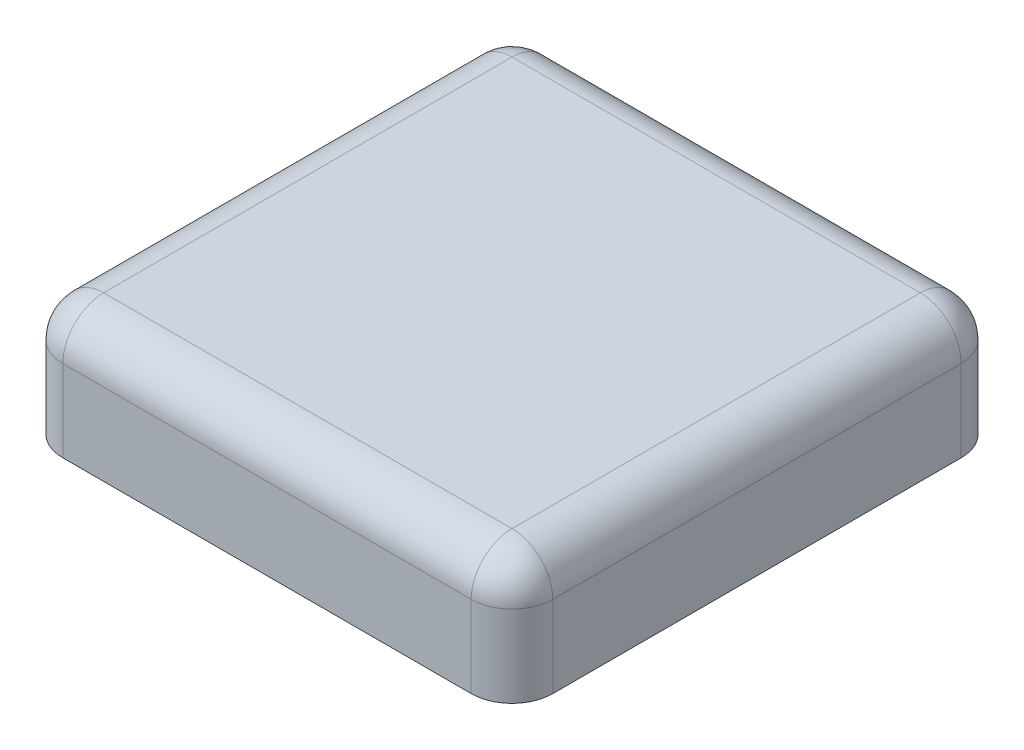
ISO-10303-21;
HEADER;
FILE_DESCRIPTION(('STEP AP214'),'2;1');
FILE_NAME('part.step','',(''),(''),'','','');
FILE_SCHEMA(('AUTOMOTIVE_DESIGN { 1 0 10303 214 1 1 1 1 }'));
ENDSEC;
DATA;
#1=APPLICATION_CONTEXT('core data for automotive mechanical design processes');
#2=APPLICATION_PROTOCOL_DEFINITION('international standard','automotive_design',2000,#1);
#3=PRODUCT_CONTEXT('',#1,'mechanical');
#4=PRODUCT('Part','Part','',(#3));
#5=PRODUCT_RELATED_PRODUCT_CATEGORY('part','',(#4));
#6=PRODUCT_DEFINITION_FORMATION('','',#4);
#7=PRODUCT_DEFINITION_CONTEXT('part definition',#1,'design');
#8=PRODUCT_DEFINITION('design','',#6,#7);
#9=PRODUCT_DEFINITION_SHAPE('','',#8);
#10=(LENGTH_UNIT() NAMED_UNIT(*) SI_UNIT(.MILLI.,.METRE.));
#11=(NAMED_UNIT(*) PLANE_ANGLE_UNIT() SI_UNIT($,.RADIAN.));
#12=(NAMED_UNIT(*) SI_UNIT($,.STERADIAN.) SOLID_ANGLE_UNIT());
#13=UNCERTAINTY_MEASURE_WITH_UNIT(LENGTH_MEASURE(1.E-05),#10,'distance_accuracy_value','');
#14=(GEOMETRIC_REPRESENTATION_CONTEXT(3) GLOBAL_UNCERTAINTY_ASSIGNED_CONTEXT((#13)) GLOBAL_UNIT_ASSIGNED_CONTEXT((#10,
#11,#12)) REPRESENTATION_CONTEXT('',''));
#15=CARTESIAN_POINT('',(0.,0.,0.));
#16=DIRECTION('',(0.,0.,1.));
#17=DIRECTION('',(1.,0.,0.));
#18=AXIS2_PLACEMENT_3D('',#15,#16,#17);
#19=CARTESIAN_POINT('',(0.,38.1,0.));
#20=DIRECTION('',(0.,0.,-1.));
#21=DIRECTION('',(-1.,0.,0.));
#22=AXIS2_PLACEMENT_3D('',#19,#20,#21);
#23=PLANE('',#22);
#24=DIRECTION('',(1.,0.,0.));
#25=VECTOR('',#24,1.);
#26=CARTESIAN_POINT('',(0.,-38.1,0.));
#27=LINE('',#26,#25);
#28=CARTESIAN_POINT('',(25.4,-38.1,0.));
#29=VERTEX_POINT('',#28);
#30=CARTESIAN_POINT('',(279.4,-38.1,0.));
#31=VERTEX_POINT('',#30);
#32=EDGE_CURVE('E130',#29,#31,#27,.T.);
#33=ORIENTED_EDGE('',*,*,#32,.F.);
#34=DIRECTION('',(0.,-1.,0.));
#35=VECTOR('',#34,1.);
#36=CARTESIAN_POINT('',(25.4,38.1,0.));
#37=LINE('',#36,#35);
#38=CARTESIAN_POINT('',(25.4,12.7,0.));
#39=VERTEX_POINT('',#38);
#40=EDGE_CURVE('E63',#29,#39,#37,.F.);
#41=ORIENTED_EDGE('',*,*,#40,.T.);
#42=DIRECTION('',(1.,0.,0.));
#43=VECTOR('',#42,1.);
#44=CARTESIAN_POINT('',(304.8,12.7,0.));
#45=LINE('',#44,#43);
#46=CARTESIAN_POINT('',(279.4,12.7,0.));
#47=VERTEX_POINT('',#46);
#48=EDGE_CURVE('E68',#39,#47,#45,.T.);
#49=ORIENTED_EDGE('',*,*,#48,.T.);
#50=DIRECTION('',(0.,-1.,0.));
#51=VECTOR('',#50,1.);
#52=CARTESIAN_POINT('',(279.4,38.1,0.));
#53=LINE('',#52,#51);
#54=EDGE_CURVE('E188',#47,#31,#53,.T.);
#55=ORIENTED_EDGE('',*,*,#54,.T.);
#56=EDGE_LOOP('',(#33,#41,#49,#55));
#57=FACE_BOUND('',#56,.T.);
#58=ADVANCED_FACE('F45',(#57),#23,.T.);
#59=CARTESIAN_POINT('',(0.,38.1,0.));
#60=DIRECTION('',(1.,0.,0.));
#61=DIRECTION('',(0.,0.,-1.));
#62=AXIS2_PLACEMENT_3D('',#59,#60,#61);
#63=PLANE('',#62);
#64=DIRECTION('',(0.,0.,1.));
#65=VECTOR('',#64,1.);
#66=CARTESIAN_POINT('',(0.,12.7,0.));
#67=LINE('',#66,#65);
#68=CARTESIAN_POINT('',(0.,12.7,279.4));
#69=VERTEX_POINT('',#68);
#70=CARTESIAN_POINT('',(0.,12.7,25.4));
#71=VERTEX_POINT('',#70);
#72=EDGE_CURVE('E182',#69,#71,#67,.F.);
#73=ORIENTED_EDGE('',*,*,#72,.T.);
#74=DIRECTION('',(0.,-1.,0.));
#75=VECTOR('',#74,1.);
#76=CARTESIAN_POINT('',(0.,-38.1,25.4));
#77=LINE('',#76,#75);
#78=CARTESIAN_POINT('',(0.,-38.1,25.4));
#79=VERTEX_POINT('',#78);
#80=EDGE_CURVE('E185',#71,#79,#77,.T.);
#81=ORIENTED_EDGE('',*,*,#80,.T.);
#82=DIRECTION('',(0.,0.,1.));
#83=VECTOR('',#82,1.);
#84=CARTESIAN_POINT('',(0.,-38.1,0.));
#85=LINE('',#84,#83);
#86=CARTESIAN_POINT('',(0.,-38.1,279.4));
#87=VERTEX_POINT('',#86);
#88=EDGE_CURVE('E249',#79,#87,#85,.T.);
#89=ORIENTED_EDGE('',*,*,#88,.T.);
#90=DIRECTION('',(0.,-1.,0.));
#91=VECTOR('',#90,1.);
#92=CARTESIAN_POINT('',(0.,38.1,279.4));
#93=LINE('',#92,#91);
#94=EDGE_CURVE('E179',#87,#69,#93,.F.);
#95=ORIENTED_EDGE('',*,*,#94,.T.);
#96=EDGE_LOOP('',(#73,#81,#89,#95));
#97=FACE_BOUND('',#96,.T.);
#98=ADVANCED_FACE('F255',(#97),#63,.F.);
#99=CARTESIAN_POINT('',(0.,38.1,304.8));
#100=DIRECTION('',(0.,0.,-1.));
#101=DIRECTION('',(-1.,0.,0.));
#102=AXIS2_PLACEMENT_3D('',#99,#100,#101);
#103=PLANE('',#102);
#104=DIRECTION('',(1.,0.,0.));
#105=VECTOR('',#104,1.);
#106=CARTESIAN_POINT('',(0.,-38.1,304.8));
#107=LINE('',#106,#105);
#108=CARTESIAN_POINT('',(25.4,-38.1,304.8));
#109=VERTEX_POINT('',#108);
#110=CARTESIAN_POINT('',(279.4,-38.1,304.8));
#111=VERTEX_POINT('',#110);
#112=EDGE_CURVE('E144',#109,#111,#107,.T.);
#113=ORIENTED_EDGE('',*,*,#112,.T.);
#114=DIRECTION('',(0.,-1.,0.));
#115=VECTOR('',#114,1.);
#116=CARTESIAN_POINT('',(279.4,38.1,304.8));
#117=LINE('',#116,#115);
#118=CARTESIAN_POINT('',(279.4,12.7,304.8));
#119=VERTEX_POINT('',#118);
#120=EDGE_CURVE('E176',#111,#119,#117,.F.);
#121=ORIENTED_EDGE('',*,*,#120,.T.);
#122=DIRECTION('',(1.,0.,0.));
#123=VECTOR('',#122,1.);
#124=CARTESIAN_POINT('',(0.,12.7,304.8));
#125=LINE('',#124,#123);
#126=CARTESIAN_POINT('',(25.4,12.7,304.8));
#127=VERTEX_POINT('',#126);
#128=EDGE_CURVE('E173',#119,#127,#125,.F.);
#129=ORIENTED_EDGE('',*,*,#128,.T.);
#130=DIRECTION('',(0.,-1.,0.));
#131=VECTOR('',#130,1.);
#132=CARTESIAN_POINT('',(25.4,38.1,304.8));
#133=LINE('',#132,#131);
#134=EDGE_CURVE('E170',#127,#109,#133,.T.);
#135=ORIENTED_EDGE('',*,*,#134,.T.);
#136=EDGE_LOOP('',(#113,#121,#129,#135));
#137=FACE_BOUND('',#136,.T.);
#138=ADVANCED_FACE('F293',(#137),#103,.F.);
#139=CARTESIAN_POINT('',(304.8,38.1,0.));
#140=DIRECTION('',(1.,0.,0.));
#141=DIRECTION('',(0.,0.,-1.));
#142=AXIS2_PLACEMENT_3D('',#139,#140,#141);
#143=PLANE('',#142);
#144=DIRECTION('',(0.,0.,1.));
#145=VECTOR('',#144,1.);
#146=CARTESIAN_POINT('',(304.8,-38.1,0.));
#147=LINE('',#146,#145);
#148=CARTESIAN_POINT('',(304.8,-38.1,25.4));
#149=VERTEX_POINT('',#148);
#150=CARTESIAN_POINT('',(304.8,-38.1,279.4));
#151=VERTEX_POINT('',#150);
#152=EDGE_CURVE('E128',#149,#151,#147,.T.);
#153=ORIENTED_EDGE('',*,*,#152,.F.);
#154=DIRECTION('',(0.,-1.,0.));
#155=VECTOR('',#154,1.);
#156=CARTESIAN_POINT('',(304.8,38.1,25.4));
#157=LINE('',#156,#155);
#158=CARTESIAN_POINT('',(304.8,12.7,25.4));
#159=VERTEX_POINT('',#158);
#160=EDGE_CURVE('E139',#149,#159,#157,.F.);
#161=ORIENTED_EDGE('',*,*,#160,.T.);
#162=DIRECTION('',(0.,0.,1.));
#163=VECTOR('',#162,1.);
#164=CARTESIAN_POINT('',(304.8,12.7,304.8));
#165=LINE('',#164,#163);
#166=CARTESIAN_POINT('',(304.8,12.7,279.4));
#167=VERTEX_POINT('',#166);
#168=EDGE_CURVE('E152',#159,#167,#165,.T.);
#169=ORIENTED_EDGE('',*,*,#168,.T.);
#170=DIRECTION('',(0.,-1.,0.));
#171=VECTOR('',#170,1.);
#172=CARTESIAN_POINT('',(304.8,-38.1,279.4));
#173=LINE('',#172,#171);
#174=EDGE_CURVE('E142',#167,#151,#173,.T.);
#175=ORIENTED_EDGE('',*,*,#174,.T.);
#176=EDGE_LOOP('',(#153,#161,#169,#175));
#177=FACE_BOUND('',#176,.T.);
#178=ADVANCED_FACE('F137',(#177),#143,.T.);
#179=CARTESIAN_POINT('',(0.,38.1,0.));
#180=DIRECTION('',(0.,-1.,0.));
#181=DIRECTION('',(0.,0.,-1.));
#182=AXIS2_PLACEMENT_3D('',#179,#180,#181);
#183=PLANE('',#182);
#184=DIRECTION('',(1.,0.,0.));
#185=VECTOR('',#184,1.);
#186=CARTESIAN_POINT('',(0.,38.1,279.4));
#187=LINE('',#186,#185);
#188=CARTESIAN_POINT('',(25.4,38.1,279.4));
#189=VERTEX_POINT('',#188);
#190=CARTESIAN_POINT('',(279.4,38.1,279.4));
#191=VERTEX_POINT('',#190);
#192=EDGE_CURVE('E163',#189,#191,#187,.T.);
#193=ORIENTED_EDGE('',*,*,#192,.T.);
#194=DIRECTION('',(0.,0.,1.));
#195=VECTOR('',#194,1.);
#196=CARTESIAN_POINT('',(279.4,38.1,0.));
#197=LINE('',#196,#195);
#198=CARTESIAN_POINT('',(279.4,38.1,25.4));
#199=VERTEX_POINT('',#198);
#200=EDGE_CURVE('E166',#191,#199,#197,.F.);
#201=ORIENTED_EDGE('',*,*,#200,.T.);
#202=DIRECTION('',(1.,0.,0.));
#203=VECTOR('',#202,1.);
#204=CARTESIAN_POINT('',(0.,38.1,25.4));
#205=LINE('',#204,#203);
#206=CARTESIAN_POINT('',(25.4,38.1,25.4));
#207=VERTEX_POINT('',#206);
#208=EDGE_CURVE('E151',#199,#207,#205,.F.);
#209=ORIENTED_EDGE('',*,*,#208,.T.);
#210=DIRECTION('',(0.,0.,1.));
#211=VECTOR('',#210,1.);
#212=CARTESIAN_POINT('',(25.4,38.1,0.));
#213=LINE('',#212,#211);
#214=EDGE_CURVE('E156',#207,#189,#213,.T.);
#215=ORIENTED_EDGE('',*,*,#214,.T.);
#216=EDGE_LOOP('',(#193,#201,#209,#215));
#217=FACE_BOUND('',#216,.T.);
#218=ADVANCED_FACE('F298',(#217),#183,.F.);
#219=CARTESIAN_POINT('',(0.,-38.1,0.));
#220=DIRECTION('',(0.,-1.,0.));
#221=DIRECTION('',(0.,0.,-1.));
#222=AXIS2_PLACEMENT_3D('',#219,#220,#221);
#223=PLANE('',#222);
#224=ORIENTED_EDGE('',*,*,#88,.F.);
#225=CARTESIAN_POINT('',(25.4,-38.1,25.4));
#226=DIRECTION('',(0.,-1.,0.));
#227=DIRECTION('',(0.,0.,-1.));
#228=AXIS2_PLACEMENT_3D('',#225,#226,#227);
#229=CIRCLE('',#228,25.4);
#230=EDGE_CURVE('E11',#79,#29,#229,.T.);
#231=ORIENTED_EDGE('',*,*,#230,.T.);
#232=ORIENTED_EDGE('',*,*,#32,.T.);
#233=CARTESIAN_POINT('',(279.4,-38.1,25.4));
#234=DIRECTION('',(0.,-1.,0.));
#235=DIRECTION('',(0.,0.,-1.));
#236=AXIS2_PLACEMENT_3D('',#233,#234,#235);
#237=CIRCLE('',#236,25.4);
#238=EDGE_CURVE('E55',#31,#149,#237,.T.);
#239=ORIENTED_EDGE('',*,*,#238,.T.);
#240=ORIENTED_EDGE('',*,*,#152,.T.);
#241=CARTESIAN_POINT('',(279.4,-38.1,279.4));
#242=DIRECTION('',(0.,-1.,0.));
#243=DIRECTION('',(0.,0.,-1.));
#244=AXIS2_PLACEMENT_3D('',#241,#242,#243);
#245=CIRCLE('',#244,25.4);
#246=EDGE_CURVE('E134',#151,#111,#245,.T.);
#247=ORIENTED_EDGE('',*,*,#246,.T.);
#248=ORIENTED_EDGE('',*,*,#112,.F.);
#249=CARTESIAN_POINT('',(25.4,-38.1,279.4));
#250=DIRECTION('',(0.,-1.,0.));
#251=DIRECTION('',(0.,0.,-1.));
#252=AXIS2_PLACEMENT_3D('',#249,#250,#251);
#253=CIRCLE('',#252,25.4);
#254=EDGE_CURVE('E195',#109,#87,#253,.T.);
#255=ORIENTED_EDGE('',*,*,#254,.T.);
#256=EDGE_LOOP('',(#224,#231,#232,#239,#240,#247,#248,#255));
#257=FACE_BOUND('',#256,.T.);
#258=ADVANCED_FACE('F127',(#257),#223,.T.);
#259=CARTESIAN_POINT('',(25.4,38.1,25.4));
#260=DIRECTION('',(0.,1.,0.));
#261=DIRECTION('',(0.,0.,1.));
#262=AXIS2_PLACEMENT_3D('',#259,#260,#261);
#263=CYLINDRICAL_SURFACE('',#262,25.4);
#264=ORIENTED_EDGE('',*,*,#230,.F.);
#265=ORIENTED_EDGE('',*,*,#80,.F.);
#266=CARTESIAN_POINT('',(25.4,12.7,25.4));
#267=DIRECTION('',(0.,1.,0.));
#268=DIRECTION('',(0.,0.,1.));
#269=AXIS2_PLACEMENT_3D('',#266,#267,#268);
#270=CIRCLE('',#269,25.4);
#271=EDGE_CURVE('E235',#39,#71,#270,.T.);
#272=ORIENTED_EDGE('',*,*,#271,.F.);
#273=ORIENTED_EDGE('',*,*,#40,.F.);
#274=EDGE_LOOP('',(#264,#265,#272,#273));
#275=FACE_BOUND('',#274,.T.);
#276=ADVANCED_FACE('F47',(#275),#263,.T.);
#277=CARTESIAN_POINT('',(25.4,38.1,279.4));
#278=DIRECTION('',(0.,-1.,0.));
#279=DIRECTION('',(0.,0.,-1.));
#280=AXIS2_PLACEMENT_3D('',#277,#278,#279);
#281=CYLINDRICAL_SURFACE('',#280,25.4);
#282=ORIENTED_EDGE('',*,*,#254,.F.);
#283=ORIENTED_EDGE('',*,*,#134,.F.);
#284=CARTESIAN_POINT('',(25.4,12.7,279.4));
#285=DIRECTION('',(0.,1.,0.));
#286=DIRECTION('',(0.,0.,1.));
#287=AXIS2_PLACEMENT_3D('',#284,#285,#286);
#288=CIRCLE('',#287,25.4);
#289=EDGE_CURVE('E232',#69,#127,#288,.T.);
#290=ORIENTED_EDGE('',*,*,#289,.F.);
#291=ORIENTED_EDGE('',*,*,#94,.F.);
#292=EDGE_LOOP('',(#282,#283,#290,#291));
#293=FACE_BOUND('',#292,.T.);
#294=ADVANCED_FACE('F262',(#293),#281,.T.);
#295=CARTESIAN_POINT('',(25.4,12.7,0.));
#296=DIRECTION('',(0.,0.,1.));
#297=DIRECTION('',(1.,0.,0.));
#298=AXIS2_PLACEMENT_3D('',#295,#296,#297);
#299=CYLINDRICAL_SURFACE('',#298,25.4);
#300=CARTESIAN_POINT('',(25.4,12.7,25.4));
#301=DIRECTION('',(0.,0.,-1.));
#302=DIRECTION('',(-1.,0.,0.));
#303=AXIS2_PLACEMENT_3D('',#300,#301,#302);
#304=CIRCLE('',#303,25.4);
#305=EDGE_CURVE('E49',#71,#207,#304,.T.);
#306=ORIENTED_EDGE('',*,*,#305,.F.);
#307=ORIENTED_EDGE('',*,*,#72,.F.);
#308=CARTESIAN_POINT('',(25.4,12.7,279.4));
#309=DIRECTION('',(0.,0.,1.));
#310=DIRECTION('',(1.,0.,0.));
#311=AXIS2_PLACEMENT_3D('',#308,#309,#310);
#312=CIRCLE('',#311,25.4);
#313=EDGE_CURVE('E228',#189,#69,#312,.T.);
#314=ORIENTED_EDGE('',*,*,#313,.F.);
#315=ORIENTED_EDGE('',*,*,#214,.F.);
#316=EDGE_LOOP('',(#306,#307,#314,#315));
#317=FACE_BOUND('',#316,.T.);
#318=ADVANCED_FACE('F271',(#317),#299,.T.);
#319=CARTESIAN_POINT('',(25.4,12.7,25.4));
#320=DIRECTION('',(-1.,0.,0.));
#321=DIRECTION('',(0.,0.,1.));
#322=AXIS2_PLACEMENT_3D('',#319,#320,#321);
#323=SPHERICAL_SURFACE('',#322,25.4);
#324=ORIENTED_EDGE('',*,*,#271,.T.);
#325=ORIENTED_EDGE('',*,*,#305,.T.);
#326=CARTESIAN_POINT('',(25.4,12.7,25.4));
#327=DIRECTION('',(-1.,0.,0.));
#328=DIRECTION('',(0.,0.,1.));
#329=AXIS2_PLACEMENT_3D('',#326,#327,#328);
#330=CIRCLE('',#329,25.4);
#331=EDGE_CURVE('E224',#39,#207,#330,.F.);
#332=ORIENTED_EDGE('',*,*,#331,.F.);
#333=EDGE_LOOP('',(#324,#325,#332));
#334=FACE_BOUND('',#333,.T.);
#335=ADVANCED_FACE('F331',(#334),#323,.T.);
#336=CARTESIAN_POINT('',(25.4,12.7,279.4));
#337=DIRECTION('',(-1.,0.,0.));
#338=DIRECTION('',(0.,0.,1.));
#339=AXIS2_PLACEMENT_3D('',#336,#337,#338);
#340=SPHERICAL_SURFACE('',#339,25.4);
#341=ORIENTED_EDGE('',*,*,#313,.T.);
#342=ORIENTED_EDGE('',*,*,#289,.T.);
#343=CARTESIAN_POINT('',(25.4,12.7,279.4));
#344=DIRECTION('',(-1.,0.,0.));
#345=DIRECTION('',(0.,0.,1.));
#346=AXIS2_PLACEMENT_3D('',#343,#344,#345);
#347=CIRCLE('',#346,25.4);
#348=EDGE_CURVE('E220',#189,#127,#347,.F.);
#349=ORIENTED_EDGE('',*,*,#348,.F.);
#350=EDGE_LOOP('',(#341,#342,#349));
#351=FACE_BOUND('',#350,.T.);
#352=ADVANCED_FACE('F267',(#351),#340,.T.);
#353=CARTESIAN_POINT('',(0.,12.7,25.4));
#354=DIRECTION('',(-1.,0.,0.));
#355=DIRECTION('',(0.,0.,1.));
#356=AXIS2_PLACEMENT_3D('',#353,#354,#355);
#357=CYLINDRICAL_SURFACE('',#356,25.4);
#358=ORIENTED_EDGE('',*,*,#331,.T.);
#359=ORIENTED_EDGE('',*,*,#208,.F.);
#360=CARTESIAN_POINT('',(279.4,12.7,25.4));
#361=DIRECTION('',(1.,0.,0.));
#362=DIRECTION('',(0.,0.,-1.));
#363=AXIS2_PLACEMENT_3D('',#360,#361,#362);
#364=CIRCLE('',#363,25.4);
#365=EDGE_CURVE('E216',#47,#199,#364,.T.);
#366=ORIENTED_EDGE('',*,*,#365,.F.);
#367=ORIENTED_EDGE('',*,*,#48,.F.);
#368=EDGE_LOOP('',(#358,#359,#366,#367));
#369=FACE_BOUND('',#368,.T.);
#370=ADVANCED_FACE('F276',(#369),#357,.T.);
#371=CARTESIAN_POINT('',(279.4,38.1,25.4));
#372=DIRECTION('',(0.,-1.,0.));
#373=DIRECTION('',(0.,0.,-1.));
#374=AXIS2_PLACEMENT_3D('',#371,#372,#373);
#375=CYLINDRICAL_SURFACE('',#374,25.4);
#376=ORIENTED_EDGE('',*,*,#238,.F.);
#377=ORIENTED_EDGE('',*,*,#54,.F.);
#378=CARTESIAN_POINT('',(279.4,12.7,25.4));
#379=DIRECTION('',(0.,1.,0.));
#380=DIRECTION('',(0.,0.,1.));
#381=AXIS2_PLACEMENT_3D('',#378,#379,#380);
#382=CIRCLE('',#381,25.4);
#383=EDGE_CURVE('E148',#159,#47,#382,.T.);
#384=ORIENTED_EDGE('',*,*,#383,.F.);
#385=ORIENTED_EDGE('',*,*,#160,.F.);
#386=EDGE_LOOP('',(#376,#377,#384,#385));
#387=FACE_BOUND('',#386,.T.);
#388=ADVANCED_FACE('F146',(#387),#375,.T.);
#389=CARTESIAN_POINT('',(279.4,38.1,279.4));
#390=DIRECTION('',(0.,1.,0.));
#391=DIRECTION('',(0.,0.,1.));
#392=AXIS2_PLACEMENT_3D('',#389,#390,#391);
#393=CYLINDRICAL_SURFACE('',#392,25.4);
#394=ORIENTED_EDGE('',*,*,#246,.F.);
#395=ORIENTED_EDGE('',*,*,#174,.F.);
#396=CARTESIAN_POINT('',(279.4,12.7,279.4));
#397=DIRECTION('',(0.,1.,0.));
#398=DIRECTION('',(0.,0.,1.));
#399=AXIS2_PLACEMENT_3D('',#396,#397,#398);
#400=CIRCLE('',#399,25.4);
#401=EDGE_CURVE('E210',#119,#167,#400,.T.);
#402=ORIENTED_EDGE('',*,*,#401,.F.);
#403=ORIENTED_EDGE('',*,*,#120,.F.);
#404=EDGE_LOOP('',(#394,#395,#402,#403));
#405=FACE_BOUND('',#404,.T.);
#406=ADVANCED_FACE('F290',(#405),#393,.T.);
#407=CARTESIAN_POINT('',(0.,12.7,279.4));
#408=DIRECTION('',(1.,0.,0.));
#409=DIRECTION('',(0.,0.,-1.));
#410=AXIS2_PLACEMENT_3D('',#407,#408,#409);
#411=CYLINDRICAL_SURFACE('',#410,25.4);
#412=ORIENTED_EDGE('',*,*,#348,.T.);
#413=ORIENTED_EDGE('',*,*,#128,.F.);
#414=CARTESIAN_POINT('',(279.4,12.7,279.4));
#415=DIRECTION('',(1.,0.,0.));
#416=DIRECTION('',(0.,0.,-1.));
#417=AXIS2_PLACEMENT_3D('',#414,#415,#416);
#418=CIRCLE('',#417,25.4);
#419=EDGE_CURVE('E206',#191,#119,#418,.T.);
#420=ORIENTED_EDGE('',*,*,#419,.F.);
#421=ORIENTED_EDGE('',*,*,#192,.F.);
#422=EDGE_LOOP('',(#412,#413,#420,#421));
#423=FACE_BOUND('',#422,.T.);
#424=ADVANCED_FACE('F296',(#423),#411,.T.);
#425=CARTESIAN_POINT('',(279.4,12.7,25.4));
#426=DIRECTION('',(0.,0.,-1.));
#427=DIRECTION('',(-1.,0.,0.));
#428=AXIS2_PLACEMENT_3D('',#425,#426,#427);
#429=SPHERICAL_SURFACE('',#428,25.4);
#430=ORIENTED_EDGE('',*,*,#383,.T.);
#431=ORIENTED_EDGE('',*,*,#365,.T.);
#432=CARTESIAN_POINT('',(279.4,12.7,25.4));
#433=DIRECTION('',(0.,0.,-1.));
#434=DIRECTION('',(-1.,0.,0.));
#435=AXIS2_PLACEMENT_3D('',#432,#433,#434);
#436=CIRCLE('',#435,25.4);
#437=EDGE_CURVE('E203',#159,#199,#436,.F.);
#438=ORIENTED_EDGE('',*,*,#437,.F.);
#439=EDGE_LOOP('',(#430,#431,#438));
#440=FACE_BOUND('',#439,.T.);
#441=ADVANCED_FACE('F278',(#440),#429,.T.);
#442=CARTESIAN_POINT('',(279.4,12.7,279.4));
#443=DIRECTION('',(0.,0.,1.));
#444=DIRECTION('',(1.,0.,0.));
#445=AXIS2_PLACEMENT_3D('',#442,#443,#444);
#446=SPHERICAL_SURFACE('',#445,25.4);
#447=ORIENTED_EDGE('',*,*,#419,.T.);
#448=ORIENTED_EDGE('',*,*,#401,.T.);
#449=CARTESIAN_POINT('',(279.4,12.7,279.4));
#450=DIRECTION('',(0.,0.,1.));
#451=DIRECTION('',(1.,0.,0.));
#452=AXIS2_PLACEMENT_3D('',#449,#450,#451);
#453=CIRCLE('',#452,25.4);
#454=EDGE_CURVE('E200',#191,#167,#453,.F.);
#455=ORIENTED_EDGE('',*,*,#454,.F.);
#456=EDGE_LOOP('',(#447,#448,#455));
#457=FACE_BOUND('',#456,.T.);
#458=ADVANCED_FACE('F286',(#457),#446,.T.);
#459=CARTESIAN_POINT('',(279.4,12.7,0.));
#460=DIRECTION('',(0.,0.,-1.));
#461=DIRECTION('',(-1.,0.,0.));
#462=AXIS2_PLACEMENT_3D('',#459,#460,#461);
#463=CYLINDRICAL_SURFACE('',#462,25.4);
#464=ORIENTED_EDGE('',*,*,#437,.T.);
#465=ORIENTED_EDGE('',*,*,#200,.F.);
#466=ORIENTED_EDGE('',*,*,#454,.T.);
#467=ORIENTED_EDGE('',*,*,#168,.F.);
#468=EDGE_LOOP('',(#464,#465,#466,#467));
#469=FACE_BOUND('',#468,.T.);
#470=ADVANCED_FACE('F282',(#469),#463,.T.);
#471=CLOSED_SHELL('',(#58,#98,#138,#178,#218,#258,#276,#294,#318,#335,#352,#370,#388,#406,#424,
#441,#458,#470));
#472=MANIFOLD_SOLID_BREP('B2',#471);
#473=ADVANCED_BREP_SHAPE_REPRESENTATION('',(#18,#472),#14);
#474=SHAPE_DEFINITION_REPRESENTATION(#9,#473);
ENDSEC;
END-ISO-10303-21;
